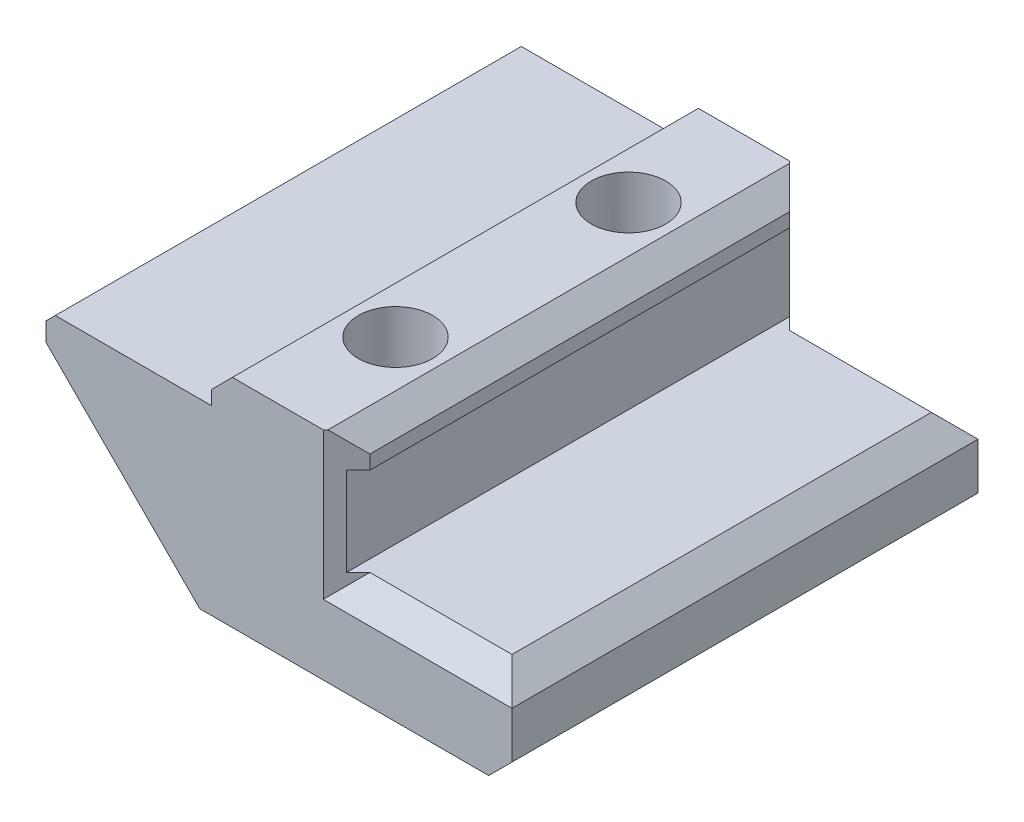
ISO-10303-21;
HEADER;
FILE_DESCRIPTION(('STEP AP214'),'2;1');
FILE_NAME('part.step','',(''),(''),'','','');
FILE_SCHEMA(('AUTOMOTIVE_DESIGN { 1 0 10303 214 1 1 1 1 }'));
ENDSEC;
DATA;
#1=APPLICATION_CONTEXT('core data for automotive mechanical design processes');
#2=APPLICATION_PROTOCOL_DEFINITION('international standard','automotive_design',2000,#1);
#3=PRODUCT_CONTEXT('',#1,'mechanical');
#4=PRODUCT('Part','Part','',(#3));
#5=PRODUCT_RELATED_PRODUCT_CATEGORY('part','',(#4));
#6=PRODUCT_DEFINITION_FORMATION('','',#4);
#7=PRODUCT_DEFINITION_CONTEXT('part definition',#1,'design');
#8=PRODUCT_DEFINITION('design','',#6,#7);
#9=PRODUCT_DEFINITION_SHAPE('','',#8);
#10=(LENGTH_UNIT() NAMED_UNIT(*) SI_UNIT(.MILLI.,.METRE.));
#11=(NAMED_UNIT(*) PLANE_ANGLE_UNIT() SI_UNIT($,.RADIAN.));
#12=(NAMED_UNIT(*) SI_UNIT($,.STERADIAN.) SOLID_ANGLE_UNIT());
#13=UNCERTAINTY_MEASURE_WITH_UNIT(LENGTH_MEASURE(1.E-05),#10,'distance_accuracy_value','');
#14=(GEOMETRIC_REPRESENTATION_CONTEXT(3) GLOBAL_UNCERTAINTY_ASSIGNED_CONTEXT((#13)) GLOBAL_UNIT_ASSIGNED_CONTEXT((#10,
#11,#12)) REPRESENTATION_CONTEXT('',''));
#15=CARTESIAN_POINT('',(0.,0.,0.));
#16=DIRECTION('',(0.,0.,1.));
#17=DIRECTION('',(1.,0.,0.));
#18=AXIS2_PLACEMENT_3D('',#15,#16,#17);
#19=CARTESIAN_POINT('',(10.,7.8,-15.));
#20=DIRECTION('',(0.,-1.,0.));
#21=DIRECTION('',(0.,0.,-1.));
#22=AXIS2_PLACEMENT_3D('',#19,#20,#21);
#23=CYLINDRICAL_SURFACE('',#22,1.6);
#24=CARTESIAN_POINT('',(10.,3.90000000000001,-15.));
#25=DIRECTION('',(0.,-1.,0.));
#26=DIRECTION('',(0.,0.,-1.));
#27=AXIS2_PLACEMENT_3D('',#24,#25,#26);
#28=CIRCLE('',#27,1.6);
#29=CARTESIAN_POINT('',(10.,3.90000000000001,-16.6));
#30=VERTEX_POINT('',#29);
#31=EDGE_CURVE('E305',#30,#30,#28,.T.);
#32=ORIENTED_EDGE('',*,*,#31,.T.);
#33=EDGE_LOOP('',(#32));
#34=FACE_BOUND('',#33,.T.);
#35=CARTESIAN_POINT('',(10.,9.3,-15.));
#36=DIRECTION('',(0.,1.,0.));
#37=DIRECTION('',(0.,0.,1.));
#38=AXIS2_PLACEMENT_3D('',#35,#36,#37);
#39=CIRCLE('',#38,1.6);
#40=CARTESIAN_POINT('',(10.,9.3,-13.4));
#41=VERTEX_POINT('',#40);
#42=EDGE_CURVE('E336',#41,#41,#39,.T.);
#43=ORIENTED_EDGE('',*,*,#42,.T.);
#44=EDGE_LOOP('',(#43));
#45=FACE_BOUND('',#44,.T.);
#46=ADVANCED_FACE('F37',(#34,#45),#23,.F.);
#47=CARTESIAN_POINT('',(10.,7.8,-5.));
#48=DIRECTION('',(0.,-1.,0.));
#49=DIRECTION('',(0.,0.,-1.));
#50=AXIS2_PLACEMENT_3D('',#47,#48,#49);
#51=CYLINDRICAL_SURFACE('',#50,1.6);
#52=CARTESIAN_POINT('',(10.,3.90000000000001,-5.));
#53=DIRECTION('',(0.,-1.,0.));
#54=DIRECTION('',(0.,0.,-1.));
#55=AXIS2_PLACEMENT_3D('',#52,#53,#54);
#56=CIRCLE('',#55,1.6);
#57=CARTESIAN_POINT('',(10.,3.90000000000001,-6.6));
#58=VERTEX_POINT('',#57);
#59=EDGE_CURVE('E302',#58,#58,#56,.T.);
#60=ORIENTED_EDGE('',*,*,#59,.T.);
#61=EDGE_LOOP('',(#60));
#62=FACE_BOUND('',#61,.T.);
#63=CARTESIAN_POINT('',(10.,9.3,-5.));
#64=DIRECTION('',(0.,1.,0.));
#65=DIRECTION('',(0.,0.,1.));
#66=AXIS2_PLACEMENT_3D('',#63,#64,#65);
#67=CIRCLE('',#66,1.6);
#68=CARTESIAN_POINT('',(10.,9.3,-3.4));
#69=VERTEX_POINT('',#68);
#70=EDGE_CURVE('E341',#69,#69,#67,.T.);
#71=ORIENTED_EDGE('',*,*,#70,.T.);
#72=EDGE_LOOP('',(#71));
#73=FACE_BOUND('',#72,.T.);
#74=ADVANCED_FACE('F422',(#62,#73),#51,.F.);
#75=CARTESIAN_POINT('',(0.,4.,0.));
#76=DIRECTION('',(0.,-1.,0.));
#77=DIRECTION('',(0.,0.,-1.));
#78=AXIS2_PLACEMENT_3D('',#75,#76,#77);
#79=PLANE('',#78);
#80=DIRECTION('',(-1.,0.,0.));
#81=VECTOR('',#80,1.);
#82=CARTESIAN_POINT('',(0.,4.,-19.));
#83=LINE('',#82,#81);
#84=CARTESIAN_POINT('',(19.,4.,-19.));
#85=VERTEX_POINT('',#84);
#86=CARTESIAN_POINT('',(12.9,4.,-19.));
#87=VERTEX_POINT('',#86);
#88=EDGE_CURVE('E210',#85,#87,#83,.T.);
#89=ORIENTED_EDGE('',*,*,#88,.T.);
#90=DIRECTION('',(0.707106781186546,0.,0.707106781186549));
#91=VECTOR('',#90,1.);
#92=CARTESIAN_POINT('',(11.9,4.,-20.));
#93=LINE('',#92,#91);
#94=CARTESIAN_POINT('',(12.4,4.,-19.5));
#95=VERTEX_POINT('',#94);
#96=EDGE_CURVE('E11',#87,#95,#93,.F.);
#97=ORIENTED_EDGE('',*,*,#96,.T.);
#98=DIRECTION('',(0.,0.,-1.));
#99=VECTOR('',#98,1.);
#100=CARTESIAN_POINT('',(12.4,4.,-20.));
#101=LINE('',#100,#99);
#102=CARTESIAN_POINT('',(12.4,4.,-0.5));
#103=VERTEX_POINT('',#102);
#104=EDGE_CURVE('E53',#103,#95,#101,.T.);
#105=ORIENTED_EDGE('',*,*,#104,.F.);
#106=DIRECTION('',(-0.707106781186549,0.,0.707106781186546));
#107=VECTOR('',#106,1.);
#108=CARTESIAN_POINT('',(12.9,4.,-1.));
#109=LINE('',#108,#107);
#110=CARTESIAN_POINT('',(12.9,4.,-1.));
#111=VERTEX_POINT('',#110);
#112=EDGE_CURVE('E226',#103,#111,#109,.F.);
#113=ORIENTED_EDGE('',*,*,#112,.T.);
#114=DIRECTION('',(1.,0.,0.));
#115=VECTOR('',#114,1.);
#116=CARTESIAN_POINT('',(0.,4.,-1.));
#117=LINE('',#116,#115);
#118=CARTESIAN_POINT('',(19.,4.,-1.));
#119=VERTEX_POINT('',#118);
#120=EDGE_CURVE('E213',#111,#119,#117,.T.);
#121=ORIENTED_EDGE('',*,*,#120,.T.);
#122=DIRECTION('',(0.,0.,-1.));
#123=VECTOR('',#122,1.);
#124=CARTESIAN_POINT('',(19.,4.,0.));
#125=LINE('',#124,#123);
#126=EDGE_CURVE('E208',#119,#85,#125,.T.);
#127=ORIENTED_EDGE('',*,*,#126,.T.);
#128=EDGE_LOOP('',(#89,#97,#105,#113,#121,#127));
#129=FACE_BOUND('',#128,.T.);
#130=ADVANCED_FACE('F267',(#129),#79,.F.);
#131=CARTESIAN_POINT('',(0.,4.,0.));
#132=DIRECTION('',(1.,0.,0.));
#133=DIRECTION('',(0.,0.,-1.));
#134=AXIS2_PLACEMENT_3D('',#131,#132,#133);
#135=PLANE('',#134);
#136=DIRECTION('',(0.,-1.,0.));
#137=VECTOR('',#136,1.);
#138=CARTESIAN_POINT('',(0.,4.,0.));
#139=LINE('',#138,#137);
#140=CARTESIAN_POINT('',(0.,7.4,0.));
#141=VERTEX_POINT('',#140);
#142=CARTESIAN_POINT('',(0.,6.6,0.));
#143=VERTEX_POINT('',#142);
#144=EDGE_CURVE('E308',#141,#143,#139,.T.);
#145=ORIENTED_EDGE('',*,*,#144,.F.);
#146=DIRECTION('',(0.,0.,-1.));
#147=VECTOR('',#146,1.);
#148=CARTESIAN_POINT('',(0.,7.4,-20.));
#149=LINE('',#148,#147);
#150=CARTESIAN_POINT('',(0.,7.4,-20.));
#151=VERTEX_POINT('',#150);
#152=EDGE_CURVE('E240',#141,#151,#149,.T.);
#153=ORIENTED_EDGE('',*,*,#152,.T.);
#154=DIRECTION('',(0.,-1.,0.));
#155=VECTOR('',#154,1.);
#156=CARTESIAN_POINT('',(0.,4.,-20.));
#157=LINE('',#156,#155);
#158=CARTESIAN_POINT('',(0.,6.6,-20.));
#159=VERTEX_POINT('',#158);
#160=EDGE_CURVE('E315',#151,#159,#157,.T.);
#161=ORIENTED_EDGE('',*,*,#160,.T.);
#162=DIRECTION('',(0.,0.,1.));
#163=VECTOR('',#162,1.);
#164=CARTESIAN_POINT('',(0.,6.6,0.));
#165=LINE('',#164,#163);
#166=EDGE_CURVE('E293',#159,#143,#165,.T.);
#167=ORIENTED_EDGE('',*,*,#166,.T.);
#168=EDGE_LOOP('',(#145,#153,#161,#167));
#169=FACE_BOUND('',#168,.T.);
#170=ADVANCED_FACE('F439',(#169),#135,.F.);
#171=CARTESIAN_POINT('',(0.,4.,0.));
#172=DIRECTION('',(0.,0.,-1.));
#173=DIRECTION('',(-1.,0.,0.));
#174=AXIS2_PLACEMENT_3D('',#171,#172,#173);
#175=PLANE('',#174);
#176=DIRECTION('',(1.,0.,0.));
#177=VECTOR('',#176,1.);
#178=CARTESIAN_POINT('',(7.1,9.3,0.));
#179=LINE('',#178,#177);
#180=CARTESIAN_POINT('',(8.,9.3,0.));
#181=VERTEX_POINT('',#180);
#182=CARTESIAN_POINT('',(11.9,9.3,0.));
#183=VERTEX_POINT('',#182);
#184=EDGE_CURVE('E335',#181,#183,#179,.T.);
#185=ORIENTED_EDGE('',*,*,#184,.F.);
#186=DIRECTION('',(-0.707106781186546,-0.707106781186549,0.));
#187=VECTOR('',#186,1.);
#188=CARTESIAN_POINT('',(8.,9.3,0.));
#189=LINE('',#188,#187);
#190=CARTESIAN_POINT('',(7.1,8.4,0.));
#191=VERTEX_POINT('',#190);
#192=EDGE_CURVE('E255',#181,#191,#189,.T.);
#193=ORIENTED_EDGE('',*,*,#192,.T.);
#194=DIRECTION('',(0.,-1.,0.));
#195=VECTOR('',#194,1.);
#196=CARTESIAN_POINT('',(7.1,9.3,0.));
#197=LINE('',#196,#195);
#198=CARTESIAN_POINT('',(7.1,7.8,0.));
#199=VERTEX_POINT('',#198);
#200=EDGE_CURVE('E328',#191,#199,#197,.T.);
#201=ORIENTED_EDGE('',*,*,#200,.T.);
#202=DIRECTION('',(1.,0.,0.));
#203=VECTOR('',#202,1.);
#204=CARTESIAN_POINT('',(0.,7.8,0.));
#205=LINE('',#204,#203);
#206=CARTESIAN_POINT('',(0.400000000000001,7.8,0.));
#207=VERTEX_POINT('',#206);
#208=EDGE_CURVE('E325',#207,#199,#205,.T.);
#209=ORIENTED_EDGE('',*,*,#208,.F.);
#210=DIRECTION('',(-0.707106781186548,-0.707106781186548,0.));
#211=VECTOR('',#210,1.);
#212=CARTESIAN_POINT('',(0.400000000000001,7.8,0.));
#213=LINE('',#212,#211);
#214=EDGE_CURVE('E238',#207,#141,#213,.T.);
#215=ORIENTED_EDGE('',*,*,#214,.T.);
#216=ORIENTED_EDGE('',*,*,#144,.T.);
#217=DIRECTION('',(0.707106781186549,-0.707106781186546,0.));
#218=VECTOR('',#217,1.);
#219=CARTESIAN_POINT('',(0.,6.6,0.));
#220=LINE('',#219,#218);
#221=CARTESIAN_POINT('',(6.60000000000002,0.,0.));
#222=VERTEX_POINT('',#221);
#223=EDGE_CURVE('E291',#143,#222,#220,.T.);
#224=ORIENTED_EDGE('',*,*,#223,.T.);
#225=DIRECTION('',(1.,0.,0.));
#226=VECTOR('',#225,1.);
#227=CARTESIAN_POINT('',(0.,0.,0.));
#228=LINE('',#227,#226);
#229=CARTESIAN_POINT('',(19.,0.,0.));
#230=VERTEX_POINT('',#229);
#231=EDGE_CURVE('E319',#222,#230,#228,.T.);
#232=ORIENTED_EDGE('',*,*,#231,.T.);
#233=DIRECTION('',(0.707106781186549,0.707106781186546,0.));
#234=VECTOR('',#233,1.);
#235=CARTESIAN_POINT('',(20.,1.,0.));
#236=LINE('',#235,#234);
#237=CARTESIAN_POINT('',(20.,1.,0.));
#238=VERTEX_POINT('',#237);
#239=EDGE_CURVE('E201',#230,#238,#236,.T.);
#240=ORIENTED_EDGE('',*,*,#239,.T.);
#241=DIRECTION('',(0.,-1.,0.));
#242=VECTOR('',#241,1.);
#243=CARTESIAN_POINT('',(20.,4.,0.));
#244=LINE('',#243,#242);
#245=CARTESIAN_POINT('',(20.,3.,0.));
#246=VERTEX_POINT('',#245);
#247=EDGE_CURVE('E310',#246,#238,#244,.T.);
#248=ORIENTED_EDGE('',*,*,#247,.F.);
#249=DIRECTION('',(-1.,0.,0.));
#250=VECTOR('',#249,1.);
#251=CARTESIAN_POINT('',(0.,3.,0.));
#252=LINE('',#251,#250);
#253=CARTESIAN_POINT('',(11.9,3.,0.));
#254=VERTEX_POINT('',#253);
#255=EDGE_CURVE('E203',#246,#254,#252,.T.);
#256=ORIENTED_EDGE('',*,*,#255,.T.);
#257=DIRECTION('',(0.,1.,0.));
#258=VECTOR('',#257,1.);
#259=CARTESIAN_POINT('',(11.9,4.,0.));
#260=LINE('',#259,#258);
#261=EDGE_CURVE('E205',#254,#183,#260,.T.);
#262=ORIENTED_EDGE('',*,*,#261,.T.);
#263=EDGE_LOOP('',(#185,#193,#201,#209,#215,#216,#224,#232,#240,#248,#256,#262));
#264=FACE_BOUND('',#263,.T.);
#265=ADVANCED_FACE('F375',(#264),#175,.F.);
#266=CARTESIAN_POINT('',(20.,4.,0.));
#267=DIRECTION('',(-1.,0.,0.));
#268=DIRECTION('',(0.,0.,1.));
#269=AXIS2_PLACEMENT_3D('',#266,#267,#268);
#270=PLANE('',#269);
#271=DIRECTION('',(0.,-1.,0.));
#272=VECTOR('',#271,1.);
#273=CARTESIAN_POINT('',(20.,4.,-20.));
#274=LINE('',#273,#272);
#275=CARTESIAN_POINT('',(20.,3.,-20.));
#276=VERTEX_POINT('',#275);
#277=CARTESIAN_POINT('',(20.,1.,-20.));
#278=VERTEX_POINT('',#277);
#279=EDGE_CURVE('E313',#276,#278,#274,.T.);
#280=ORIENTED_EDGE('',*,*,#279,.F.);
#281=DIRECTION('',(0.,0.,1.));
#282=VECTOR('',#281,1.);
#283=CARTESIAN_POINT('',(20.,3.,0.));
#284=LINE('',#283,#282);
#285=EDGE_CURVE('E218',#276,#246,#284,.T.);
#286=ORIENTED_EDGE('',*,*,#285,.T.);
#287=ORIENTED_EDGE('',*,*,#247,.T.);
#288=DIRECTION('',(0.,0.,-1.));
#289=VECTOR('',#288,1.);
#290=CARTESIAN_POINT('',(20.,1.,-20.));
#291=LINE('',#290,#289);
#292=EDGE_CURVE('E215',#238,#278,#291,.T.);
#293=ORIENTED_EDGE('',*,*,#292,.T.);
#294=EDGE_LOOP('',(#280,#286,#287,#293));
#295=FACE_BOUND('',#294,.T.);
#296=ADVANCED_FACE('F371',(#295),#270,.F.);
#297=CARTESIAN_POINT('',(0.,4.,-20.));
#298=DIRECTION('',(0.,0.,1.));
#299=DIRECTION('',(1.,0.,0.));
#300=AXIS2_PLACEMENT_3D('',#297,#298,#299);
#301=PLANE('',#300);
#302=DIRECTION('',(0.,-1.,0.));
#303=VECTOR('',#302,1.);
#304=CARTESIAN_POINT('',(7.1,9.3,-20.));
#305=LINE('',#304,#303);
#306=CARTESIAN_POINT('',(7.1,8.4,-20.));
#307=VERTEX_POINT('',#306);
#308=CARTESIAN_POINT('',(7.1,7.8,-20.));
#309=VERTEX_POINT('',#308);
#310=EDGE_CURVE('E330',#307,#309,#305,.T.);
#311=ORIENTED_EDGE('',*,*,#310,.F.);
#312=DIRECTION('',(0.707106781186546,0.707106781186549,0.));
#313=VECTOR('',#312,1.);
#314=CARTESIAN_POINT('',(8.,9.3,-20.));
#315=LINE('',#314,#313);
#316=CARTESIAN_POINT('',(8.,9.3,-20.));
#317=VERTEX_POINT('',#316);
#318=EDGE_CURVE('E258',#307,#317,#315,.T.);
#319=ORIENTED_EDGE('',*,*,#318,.T.);
#320=DIRECTION('',(-1.,0.,0.));
#321=VECTOR('',#320,1.);
#322=CARTESIAN_POINT('',(7.1,9.3,-20.));
#323=LINE('',#322,#321);
#324=CARTESIAN_POINT('',(11.9,9.3,-20.));
#325=VERTEX_POINT('',#324);
#326=EDGE_CURVE('E282',#325,#317,#323,.T.);
#327=ORIENTED_EDGE('',*,*,#326,.F.);
#328=DIRECTION('',(0.,-1.,0.));
#329=VECTOR('',#328,1.);
#330=CARTESIAN_POINT('',(11.9,4.,-20.));
#331=LINE('',#330,#329);
#332=CARTESIAN_POINT('',(11.9,3.,-20.));
#333=VERTEX_POINT('',#332);
#334=EDGE_CURVE('E196',#325,#333,#331,.T.);
#335=ORIENTED_EDGE('',*,*,#334,.T.);
#336=DIRECTION('',(1.,0.,0.));
#337=VECTOR('',#336,1.);
#338=CARTESIAN_POINT('',(0.,3.,-20.));
#339=LINE('',#338,#337);
#340=EDGE_CURVE('E272',#333,#276,#339,.T.);
#341=ORIENTED_EDGE('',*,*,#340,.T.);
#342=ORIENTED_EDGE('',*,*,#279,.T.);
#343=DIRECTION('',(-0.707106781186549,-0.707106781186546,0.));
#344=VECTOR('',#343,1.);
#345=CARTESIAN_POINT('',(20.,1.,-20.));
#346=LINE('',#345,#344);
#347=CARTESIAN_POINT('',(19.,0.,-20.));
#348=VERTEX_POINT('',#347);
#349=EDGE_CURVE('E277',#278,#348,#346,.T.);
#350=ORIENTED_EDGE('',*,*,#349,.T.);
#351=DIRECTION('',(-1.,0.,0.));
#352=VECTOR('',#351,1.);
#353=CARTESIAN_POINT('',(0.,0.,-20.));
#354=LINE('',#353,#352);
#355=CARTESIAN_POINT('',(6.60000000000002,0.,-20.));
#356=VERTEX_POINT('',#355);
#357=EDGE_CURVE('E317',#348,#356,#354,.T.);
#358=ORIENTED_EDGE('',*,*,#357,.T.);
#359=DIRECTION('',(-0.707106781186549,0.707106781186546,0.));
#360=VECTOR('',#359,1.);
#361=CARTESIAN_POINT('',(0.,6.6,-20.));
#362=LINE('',#361,#360);
#363=EDGE_CURVE('E285',#356,#159,#362,.T.);
#364=ORIENTED_EDGE('',*,*,#363,.T.);
#365=ORIENTED_EDGE('',*,*,#160,.F.);
#366=DIRECTION('',(0.707106781186548,0.707106781186548,0.));
#367=VECTOR('',#366,1.);
#368=CARTESIAN_POINT('',(0.400000000000001,7.8,-20.));
#369=LINE('',#368,#367);
#370=CARTESIAN_POINT('',(0.400000000000001,7.8,-20.));
#371=VERTEX_POINT('',#370);
#372=EDGE_CURVE('E242',#151,#371,#369,.T.);
#373=ORIENTED_EDGE('',*,*,#372,.T.);
#374=DIRECTION('',(-1.,0.,0.));
#375=VECTOR('',#374,1.);
#376=CARTESIAN_POINT('',(0.,7.8,-20.));
#377=LINE('',#376,#375);
#378=EDGE_CURVE('E322',#309,#371,#377,.T.);
#379=ORIENTED_EDGE('',*,*,#378,.F.);
#380=EDGE_LOOP('',(#311,#319,#327,#335,#341,#342,#350,#358,#364,#365,#373,#379));
#381=FACE_BOUND('',#380,.T.);
#382=ADVANCED_FACE('F280',(#381),#301,.F.);
#383=CARTESIAN_POINT('',(0.,0.,0.));
#384=DIRECTION('',(0.,-1.,0.));
#385=DIRECTION('',(0.,0.,-1.));
#386=AXIS2_PLACEMENT_3D('',#383,#384,#385);
#387=PLANE('',#386);
#388=CARTESIAN_POINT('',(10.,0.,-5.));
#389=DIRECTION('',(0.,-1.,0.));
#390=DIRECTION('',(0.,0.,-1.));
#391=AXIS2_PLACEMENT_3D('',#388,#389,#390);
#392=CIRCLE('',#391,3.);
#393=CARTESIAN_POINT('',(10.,0.,-8.));
#394=VERTEX_POINT('',#393);
#395=EDGE_CURVE('E344',#394,#394,#392,.T.);
#396=ORIENTED_EDGE('',*,*,#395,.F.);
#397=EDGE_LOOP('',(#396));
#398=FACE_BOUND('',#397,.T.);
#399=CARTESIAN_POINT('',(10.,0.,-15.));
#400=DIRECTION('',(0.,-1.,0.));
#401=DIRECTION('',(0.,0.,-1.));
#402=AXIS2_PLACEMENT_3D('',#399,#400,#401);
#403=CIRCLE('',#402,3.);
#404=CARTESIAN_POINT('',(10.,0.,-18.));
#405=VERTEX_POINT('',#404);
#406=EDGE_CURVE('E235',#405,#405,#403,.T.);
#407=ORIENTED_EDGE('',*,*,#406,.F.);
#408=EDGE_LOOP('',(#407));
#409=FACE_BOUND('',#408,.T.);
#410=ORIENTED_EDGE('',*,*,#357,.F.);
#411=DIRECTION('',(0.,0.,1.));
#412=VECTOR('',#411,1.);
#413=CARTESIAN_POINT('',(19.,0.,0.));
#414=LINE('',#413,#412);
#415=EDGE_CURVE('E220',#348,#230,#414,.T.);
#416=ORIENTED_EDGE('',*,*,#415,.T.);
#417=ORIENTED_EDGE('',*,*,#231,.F.);
#418=DIRECTION('',(0.,0.,-1.));
#419=VECTOR('',#418,1.);
#420=CARTESIAN_POINT('',(6.60000000000002,0.,-20.));
#421=LINE('',#420,#419);
#422=EDGE_CURVE('E288',#222,#356,#421,.T.);
#423=ORIENTED_EDGE('',*,*,#422,.T.);
#424=EDGE_LOOP('',(#410,#416,#417,#423));
#425=FACE_BOUND('',#424,.T.);
#426=ADVANCED_FACE('F383',(#398,#409,#425),#387,.T.);
#427=CARTESIAN_POINT('',(12.9,7.8,-20.));
#428=DIRECTION('',(-1.,0.,0.));
#429=DIRECTION('',(0.,0.,1.));
#430=AXIS2_PLACEMENT_3D('',#427,#428,#429);
#431=PLANE('',#430);
#432=DIRECTION('',(0.,-1.,0.));
#433=VECTOR('',#432,1.);
#434=CARTESIAN_POINT('',(12.9,7.8,-1.));
#435=LINE('',#434,#433);
#436=CARTESIAN_POINT('',(12.9,8.4,-1.));
#437=VERTEX_POINT('',#436);
#438=CARTESIAN_POINT('',(12.9,7.8,-1.));
#439=VERTEX_POINT('',#438);
#440=EDGE_CURVE('E185',#437,#439,#435,.T.);
#441=ORIENTED_EDGE('',*,*,#440,.T.);
#442=DIRECTION('',(0.,0.,1.));
#443=VECTOR('',#442,1.);
#444=CARTESIAN_POINT('',(12.9,7.8,-20.));
#445=LINE('',#444,#443);
#446=CARTESIAN_POINT('',(12.9,7.8,-19.));
#447=VERTEX_POINT('',#446);
#448=EDGE_CURVE('E171',#447,#439,#445,.T.);
#449=ORIENTED_EDGE('',*,*,#448,.F.);
#450=DIRECTION('',(0.,1.,0.));
#451=VECTOR('',#450,1.);
#452=CARTESIAN_POINT('',(12.9,7.8,-19.));
#453=LINE('',#452,#451);
#454=CARTESIAN_POINT('',(12.9,8.4,-19.));
#455=VERTEX_POINT('',#454);
#456=EDGE_CURVE('E182',#447,#455,#453,.T.);
#457=ORIENTED_EDGE('',*,*,#456,.T.);
#458=DIRECTION('',(0.,0.,1.));
#459=VECTOR('',#458,1.);
#460=CARTESIAN_POINT('',(12.9,8.4,-1.));
#461=LINE('',#460,#459);
#462=EDGE_CURVE('E251',#455,#437,#461,.T.);
#463=ORIENTED_EDGE('',*,*,#462,.T.);
#464=EDGE_LOOP('',(#441,#449,#457,#463));
#465=FACE_BOUND('',#464,.T.);
#466=ADVANCED_FACE('F181',(#465),#431,.F.);
#467=CARTESIAN_POINT('',(0.,7.8,0.));
#468=DIRECTION('',(0.,1.,0.));
#469=DIRECTION('',(0.,0.,1.));
#470=AXIS2_PLACEMENT_3D('',#467,#468,#469);
#471=PLANE('',#470);
#472=ORIENTED_EDGE('',*,*,#378,.T.);
#473=DIRECTION('',(0.,0.,1.));
#474=VECTOR('',#473,1.);
#475=CARTESIAN_POINT('',(0.400000000000001,7.8,0.));
#476=LINE('',#475,#474);
#477=EDGE_CURVE('E222',#371,#207,#476,.T.);
#478=ORIENTED_EDGE('',*,*,#477,.T.);
#479=ORIENTED_EDGE('',*,*,#208,.T.);
#480=DIRECTION('',(0.,0.,1.));
#481=VECTOR('',#480,1.);
#482=CARTESIAN_POINT('',(7.1,7.8,-20.));
#483=LINE('',#482,#481);
#484=EDGE_CURVE('E332',#309,#199,#483,.T.);
#485=ORIENTED_EDGE('',*,*,#484,.F.);
#486=EDGE_LOOP('',(#472,#478,#479,#485));
#487=FACE_BOUND('',#486,.T.);
#488=ADVANCED_FACE('F400',(#487),#471,.T.);
#489=CARTESIAN_POINT('',(0.,9.3,0.));
#490=DIRECTION('',(0.,1.,0.));
#491=DIRECTION('',(0.,0.,1.));
#492=AXIS2_PLACEMENT_3D('',#489,#490,#491);
#493=PLANE('',#492);
#494=ORIENTED_EDGE('',*,*,#42,.F.);
#495=EDGE_LOOP('',(#494));
#496=FACE_BOUND('',#495,.T.);
#497=DIRECTION('',(-0.707106781186549,0.,0.707106781186546));
#498=VECTOR('',#497,1.);
#499=CARTESIAN_POINT('',(5.94999999999998,9.3,5.95));
#500=LINE('',#499,#498);
#501=CARTESIAN_POINT('',(12.,9.3,-0.100000000000006));
#502=VERTEX_POINT('',#501);
#503=EDGE_CURVE('E191',#183,#502,#500,.F.);
#504=ORIENTED_EDGE('',*,*,#503,.T.);
#505=DIRECTION('',(0.,0.,-1.));
#506=VECTOR('',#505,1.);
#507=CARTESIAN_POINT('',(12.,9.3,-19.));
#508=LINE('',#507,#506);
#509=CARTESIAN_POINT('',(12.,9.3,-19.9));
#510=VERTEX_POINT('',#509);
#511=EDGE_CURVE('E247',#502,#510,#508,.T.);
#512=ORIENTED_EDGE('',*,*,#511,.T.);
#513=DIRECTION('',(0.707106781186546,0.,0.707106781186549));
#514=VECTOR('',#513,1.);
#515=CARTESIAN_POINT('',(15.95,9.3,-15.95));
#516=LINE('',#515,#514);
#517=EDGE_CURVE('E194',#510,#325,#516,.F.);
#518=ORIENTED_EDGE('',*,*,#517,.T.);
#519=ORIENTED_EDGE('',*,*,#326,.T.);
#520=DIRECTION('',(0.,0.,1.));
#521=VECTOR('',#520,1.);
#522=CARTESIAN_POINT('',(8.,9.3,0.));
#523=LINE('',#522,#521);
#524=EDGE_CURVE('E244',#317,#181,#523,.T.);
#525=ORIENTED_EDGE('',*,*,#524,.T.);
#526=ORIENTED_EDGE('',*,*,#184,.T.);
#527=EDGE_LOOP('',(#504,#512,#518,#519,#525,#526));
#528=FACE_BOUND('',#527,.T.);
#529=ORIENTED_EDGE('',*,*,#70,.F.);
#530=EDGE_LOOP('',(#529));
#531=FACE_BOUND('',#530,.T.);
#532=ADVANCED_FACE('F408',(#496,#528,#531),#493,.T.);
#533=CARTESIAN_POINT('',(7.1,9.3,-20.));
#534=DIRECTION('',(1.,0.,0.));
#535=DIRECTION('',(0.,0.,-1.));
#536=AXIS2_PLACEMENT_3D('',#533,#534,#535);
#537=PLANE('',#536);
#538=ORIENTED_EDGE('',*,*,#200,.F.);
#539=DIRECTION('',(0.,0.,-1.));
#540=VECTOR('',#539,1.);
#541=CARTESIAN_POINT('',(7.1,8.4,-20.));
#542=LINE('',#541,#540);
#543=EDGE_CURVE('E60',#191,#307,#542,.T.);
#544=ORIENTED_EDGE('',*,*,#543,.T.);
#545=ORIENTED_EDGE('',*,*,#310,.T.);
#546=ORIENTED_EDGE('',*,*,#484,.T.);
#547=EDGE_LOOP('',(#538,#544,#545,#546));
#548=FACE_BOUND('',#547,.T.);
#549=ADVANCED_FACE('F403',(#548),#537,.F.);
#550=CARTESIAN_POINT('',(10.,2.4,-5.));
#551=DIRECTION('',(0.,-1.,0.));
#552=DIRECTION('',(0.,0.,-1.));
#553=AXIS2_PLACEMENT_3D('',#550,#551,#552);
#554=CYLINDRICAL_SURFACE('',#553,3.);
#555=CARTESIAN_POINT('',(10.,2.50000000000002,-5.));
#556=DIRECTION('',(0.,-1.,0.));
#557=DIRECTION('',(0.,0.,-1.));
#558=AXIS2_PLACEMENT_3D('',#555,#556,#557);
#559=CIRCLE('',#558,3.);
#560=CARTESIAN_POINT('',(10.,2.50000000000002,-8.));
#561=VERTEX_POINT('',#560);
#562=EDGE_CURVE('E296',#561,#561,#559,.F.);
#563=ORIENTED_EDGE('',*,*,#562,.T.);
#564=EDGE_LOOP('',(#563));
#565=FACE_BOUND('',#564,.T.);
#566=ORIENTED_EDGE('',*,*,#395,.T.);
#567=EDGE_LOOP('',(#566));
#568=FACE_BOUND('',#567,.T.);
#569=ADVANCED_FACE('F553',(#565,#568),#554,.F.);
#570=CARTESIAN_POINT('',(10.,2.4,-15.));
#571=DIRECTION('',(0.,-1.,0.));
#572=DIRECTION('',(0.,0.,-1.));
#573=AXIS2_PLACEMENT_3D('',#570,#571,#572);
#574=CYLINDRICAL_SURFACE('',#573,3.);
#575=CARTESIAN_POINT('',(10.,2.50000000000002,-15.));
#576=DIRECTION('',(0.,-1.,0.));
#577=DIRECTION('',(0.,0.,-1.));
#578=AXIS2_PLACEMENT_3D('',#575,#576,#577);
#579=CIRCLE('',#578,3.);
#580=CARTESIAN_POINT('',(10.,2.50000000000002,-18.));
#581=VERTEX_POINT('',#580);
#582=EDGE_CURVE('E299',#581,#581,#579,.F.);
#583=ORIENTED_EDGE('',*,*,#582,.T.);
#584=EDGE_LOOP('',(#583));
#585=FACE_BOUND('',#584,.T.);
#586=ORIENTED_EDGE('',*,*,#406,.T.);
#587=EDGE_LOOP('',(#586));
#588=FACE_BOUND('',#587,.T.);
#589=ADVANCED_FACE('F459',(#585,#588),#574,.F.);
#590=CARTESIAN_POINT('',(10.,2.4,-15.));
#591=DIRECTION('',(0.,-1.,0.));
#592=DIRECTION('',(0.,0.,-1.));
#593=AXIS2_PLACEMENT_3D('',#590,#591,#592);
#594=CONICAL_SURFACE('',#593,3.10000000000003,0.785398163397453);
#595=ORIENTED_EDGE('',*,*,#31,.F.);
#596=EDGE_LOOP('',(#595));
#597=FACE_BOUND('',#596,.T.);
#598=ORIENTED_EDGE('',*,*,#582,.F.);
#599=EDGE_LOOP('',(#598));
#600=FACE_BOUND('',#599,.T.);
#601=ADVANCED_FACE('F452',(#597,#600),#594,.F.);
#602=CARTESIAN_POINT('',(10.,2.4,-5.));
#603=DIRECTION('',(0.,-1.,0.));
#604=DIRECTION('',(0.,0.,-1.));
#605=AXIS2_PLACEMENT_3D('',#602,#603,#604);
#606=CONICAL_SURFACE('',#605,3.10000000000003,0.785398163397453);
#607=ORIENTED_EDGE('',*,*,#59,.F.);
#608=EDGE_LOOP('',(#607));
#609=FACE_BOUND('',#608,.T.);
#610=ORIENTED_EDGE('',*,*,#562,.F.);
#611=EDGE_LOOP('',(#610));
#612=FACE_BOUND('',#611,.T.);
#613=ADVANCED_FACE('F458',(#609,#612),#606,.F.);
#614=CARTESIAN_POINT('',(0.,6.6,0.));
#615=DIRECTION('',(-0.707106781186546,-0.707106781186549,0.));
#616=DIRECTION('',(0.,0.,-1.));
#617=AXIS2_PLACEMENT_3D('',#614,#615,#616);
#618=PLANE('',#617);
#619=ORIENTED_EDGE('',*,*,#363,.F.);
#620=ORIENTED_EDGE('',*,*,#422,.F.);
#621=ORIENTED_EDGE('',*,*,#223,.F.);
#622=ORIENTED_EDGE('',*,*,#166,.F.);
#623=EDGE_LOOP('',(#619,#620,#621,#622));
#624=FACE_BOUND('',#623,.T.);
#625=ADVANCED_FACE('F389',(#624),#618,.T.);
#626=CARTESIAN_POINT('',(12.9,7.8,-1.));
#627=DIRECTION('',(-0.707106781186546,0.,-0.707106781186549));
#628=DIRECTION('',(0.,-1.,0.));
#629=AXIS2_PLACEMENT_3D('',#626,#627,#628);
#630=PLANE('',#629);
#631=ORIENTED_EDGE('',*,*,#112,.F.);
#632=DIRECTION('',(0.,1.,0.));
#633=VECTOR('',#632,1.);
#634=CARTESIAN_POINT('',(12.4,7.8,-0.500000000000002));
#635=LINE('',#634,#633);
#636=CARTESIAN_POINT('',(12.4,7.8,-0.5));
#637=VERTEX_POINT('',#636);
#638=EDGE_CURVE('E352',#637,#103,#635,.F.);
#639=ORIENTED_EDGE('',*,*,#638,.F.);
#640=DIRECTION('',(0.707106781186549,0.,-0.707106781186546));
#641=VECTOR('',#640,1.);
#642=CARTESIAN_POINT('',(12.9,7.8,-1.));
#643=LINE('',#642,#641);
#644=EDGE_CURVE('E350',#439,#637,#643,.F.);
#645=ORIENTED_EDGE('',*,*,#644,.F.);
#646=ORIENTED_EDGE('',*,*,#440,.F.);
#647=DIRECTION('',(0.577350269189625,-0.577350269189629,-0.577350269189623));
#648=VECTOR('',#647,1.);
#649=CARTESIAN_POINT('',(13.1,8.2,-1.2));
#650=LINE('',#649,#648);
#651=EDGE_CURVE('E253',#437,#502,#650,.F.);
#652=ORIENTED_EDGE('',*,*,#651,.T.);
#653=ORIENTED_EDGE('',*,*,#503,.F.);
#654=ORIENTED_EDGE('',*,*,#261,.F.);
#655=DIRECTION('',(-0.577350269189626,-0.577350269189626,0.577350269189624));
#656=VECTOR('',#655,1.);
#657=CARTESIAN_POINT('',(14.1666666666667,5.26666666666667,-2.26666666666667));
#658=LINE('',#657,#656);
#659=EDGE_CURVE('E232',#111,#254,#658,.T.);
#660=ORIENTED_EDGE('',*,*,#659,.F.);
#661=EDGE_LOOP('',(#631,#639,#645,#646,#652,#653,#654,#660));
#662=FACE_BOUND('',#661,.T.);
#663=ADVANCED_FACE('F358',(#662),#630,.F.);
#664=CARTESIAN_POINT('',(0.,4.,-1.));
#665=DIRECTION('',(0.,-0.707106781186546,-0.707106781186549));
#666=DIRECTION('',(1.,0.,0.));
#667=AXIS2_PLACEMENT_3D('',#664,#665,#666);
#668=PLANE('',#667);
#669=ORIENTED_EDGE('',*,*,#659,.T.);
#670=ORIENTED_EDGE('',*,*,#255,.F.);
#671=DIRECTION('',(0.577350269189625,-0.577350269189627,0.577350269189625));
#672=VECTOR('',#671,1.);
#673=CARTESIAN_POINT('',(19.3333333333333,3.66666666666667,-0.666666666666668));
#674=LINE('',#673,#672);
#675=EDGE_CURVE('E229',#119,#246,#674,.T.);
#676=ORIENTED_EDGE('',*,*,#675,.F.);
#677=ORIENTED_EDGE('',*,*,#120,.F.);
#678=EDGE_LOOP('',(#669,#670,#676,#677));
#679=FACE_BOUND('',#678,.T.);
#680=ADVANCED_FACE('F365',(#679),#668,.F.);
#681=CARTESIAN_POINT('',(19.,4.,0.));
#682=DIRECTION('',(-0.707106781186549,-0.707106781186546,0.));
#683=DIRECTION('',(0.,0.,-1.));
#684=AXIS2_PLACEMENT_3D('',#681,#682,#683);
#685=PLANE('',#684);
#686=ORIENTED_EDGE('',*,*,#675,.T.);
#687=ORIENTED_EDGE('',*,*,#285,.F.);
#688=DIRECTION('',(-0.577350269189625,0.577350269189627,0.577350269189625));
#689=VECTOR('',#688,1.);
#690=CARTESIAN_POINT('',(12.6666666666667,10.3333333333333,-12.6666666666667));
#691=LINE('',#690,#689);
#692=EDGE_CURVE('E225',#85,#276,#691,.F.);
#693=ORIENTED_EDGE('',*,*,#692,.F.);
#694=ORIENTED_EDGE('',*,*,#126,.F.);
#695=EDGE_LOOP('',(#686,#687,#693,#694));
#696=FACE_BOUND('',#695,.T.);
#697=ADVANCED_FACE('F368',(#696),#685,.F.);
#698=CARTESIAN_POINT('',(0.,4.,-19.));
#699=DIRECTION('',(0.,-0.707106781186546,0.707106781186549));
#700=DIRECTION('',(-1.,0.,0.));
#701=AXIS2_PLACEMENT_3D('',#698,#699,#700);
#702=PLANE('',#701);
#703=ORIENTED_EDGE('',*,*,#692,.T.);
#704=ORIENTED_EDGE('',*,*,#340,.F.);
#705=DIRECTION('',(0.577350269189624,0.577350269189628,0.577350269189626));
#706=VECTOR('',#705,1.);
#707=CARTESIAN_POINT('',(12.2333333333333,3.33333333333333,-19.6666666666667));
#708=LINE('',#707,#706);
#709=EDGE_CURVE('E223',#87,#333,#708,.F.);
#710=ORIENTED_EDGE('',*,*,#709,.F.);
#711=ORIENTED_EDGE('',*,*,#88,.F.);
#712=EDGE_LOOP('',(#703,#704,#710,#711));
#713=FACE_BOUND('',#712,.T.);
#714=ADVANCED_FACE('F271',(#713),#702,.F.);
#715=CARTESIAN_POINT('',(11.9,4.,-20.));
#716=DIRECTION('',(-0.707106781186549,0.,0.707106781186546));
#717=DIRECTION('',(0.,-1.,0.));
#718=AXIS2_PLACEMENT_3D('',#715,#716,#717);
#719=PLANE('',#718);
#720=ORIENTED_EDGE('',*,*,#96,.F.);
#721=ORIENTED_EDGE('',*,*,#709,.T.);
#722=ORIENTED_EDGE('',*,*,#334,.F.);
#723=ORIENTED_EDGE('',*,*,#517,.F.);
#724=DIRECTION('',(-0.577350269189624,0.577350269189627,-0.577350269189626));
#725=VECTOR('',#724,1.);
#726=CARTESIAN_POINT('',(13.7,7.59999999999999,-18.2));
#727=LINE('',#726,#725);
#728=EDGE_CURVE('E189',#510,#455,#727,.F.);
#729=ORIENTED_EDGE('',*,*,#728,.T.);
#730=ORIENTED_EDGE('',*,*,#456,.F.);
#731=DIRECTION('',(-0.707106781186546,0.,-0.707106781186549));
#732=VECTOR('',#731,1.);
#733=CARTESIAN_POINT('',(11.9,7.8,-20.));
#734=LINE('',#733,#732);
#735=CARTESIAN_POINT('',(12.4,7.8,-19.5));
#736=VERTEX_POINT('',#735);
#737=EDGE_CURVE('E46',#736,#447,#734,.F.);
#738=ORIENTED_EDGE('',*,*,#737,.F.);
#739=DIRECTION('',(0.,-1.,0.));
#740=VECTOR('',#739,1.);
#741=CARTESIAN_POINT('',(12.4,4.,-19.5));
#742=LINE('',#741,#740);
#743=EDGE_CURVE('E178',#95,#736,#742,.F.);
#744=ORIENTED_EDGE('',*,*,#743,.F.);
#745=EDGE_LOOP('',(#720,#721,#722,#723,#729,#730,#738,#744));
#746=FACE_BOUND('',#745,.T.);
#747=ADVANCED_FACE('F187',(#746),#719,.F.);
#748=CARTESIAN_POINT('',(20.,1.,0.));
#749=DIRECTION('',(0.707106781186546,-0.707106781186549,0.));
#750=DIRECTION('',(0.,0.,1.));
#751=AXIS2_PLACEMENT_3D('',#748,#749,#750);
#752=PLANE('',#751);
#753=ORIENTED_EDGE('',*,*,#239,.F.);
#754=ORIENTED_EDGE('',*,*,#415,.F.);
#755=ORIENTED_EDGE('',*,*,#349,.F.);
#756=ORIENTED_EDGE('',*,*,#292,.F.);
#757=EDGE_LOOP('',(#753,#754,#755,#756));
#758=FACE_BOUND('',#757,.T.);
#759=ADVANCED_FACE('F380',(#758),#752,.T.);
#760=CARTESIAN_POINT('',(0.400000000000001,7.8,0.));
#761=DIRECTION('',(-0.707106781186547,0.707106781186547,0.));
#762=DIRECTION('',(0.,0.,-1.));
#763=AXIS2_PLACEMENT_3D('',#760,#761,#762);
#764=PLANE('',#763);
#765=ORIENTED_EDGE('',*,*,#372,.F.);
#766=ORIENTED_EDGE('',*,*,#152,.F.);
#767=ORIENTED_EDGE('',*,*,#214,.F.);
#768=ORIENTED_EDGE('',*,*,#477,.F.);
#769=EDGE_LOOP('',(#765,#766,#767,#768));
#770=FACE_BOUND('',#769,.T.);
#771=ADVANCED_FACE('F397',(#770),#764,.T.);
#772=CARTESIAN_POINT('',(12.,9.3,0.));
#773=DIRECTION('',(0.70710678118655,0.707106781186545,0.));
#774=DIRECTION('',(0.,0.,1.));
#775=AXIS2_PLACEMENT_3D('',#772,#773,#774);
#776=PLANE('',#775);
#777=ORIENTED_EDGE('',*,*,#651,.F.);
#778=ORIENTED_EDGE('',*,*,#462,.F.);
#779=ORIENTED_EDGE('',*,*,#728,.F.);
#780=ORIENTED_EDGE('',*,*,#511,.F.);
#781=EDGE_LOOP('',(#777,#778,#779,#780));
#782=FACE_BOUND('',#781,.T.);
#783=ADVANCED_FACE('F413',(#782),#776,.T.);
#784=CARTESIAN_POINT('',(8.,9.3,0.));
#785=DIRECTION('',(-0.707106781186549,0.707106781186546,0.));
#786=DIRECTION('',(0.,0.,-1.));
#787=AXIS2_PLACEMENT_3D('',#784,#785,#786);
#788=PLANE('',#787);
#789=ORIENTED_EDGE('',*,*,#318,.F.);
#790=ORIENTED_EDGE('',*,*,#543,.F.);
#791=ORIENTED_EDGE('',*,*,#192,.F.);
#792=ORIENTED_EDGE('',*,*,#524,.F.);
#793=EDGE_LOOP('',(#789,#790,#791,#792));
#794=FACE_BOUND('',#793,.T.);
#795=ADVANCED_FACE('F40',(#794),#788,.T.);
#796=CARTESIAN_POINT('',(12.4,7.8,-20.));
#797=DIRECTION('',(0.,1.,0.));
#798=DIRECTION('',(0.,0.,1.));
#799=AXIS2_PLACEMENT_3D('',#796,#797,#798);
#800=PLANE('',#799);
#801=ORIENTED_EDGE('',*,*,#644,.T.);
#802=DIRECTION('',(0.,0.,1.));
#803=VECTOR('',#802,1.);
#804=CARTESIAN_POINT('',(12.4,7.8,-20.));
#805=LINE('',#804,#803);
#806=EDGE_CURVE('E174',#736,#637,#805,.T.);
#807=ORIENTED_EDGE('',*,*,#806,.F.);
#808=ORIENTED_EDGE('',*,*,#737,.T.);
#809=ORIENTED_EDGE('',*,*,#448,.T.);
#810=EDGE_LOOP('',(#801,#807,#808,#809));
#811=FACE_BOUND('',#810,.T.);
#812=ADVANCED_FACE('F170',(#811),#800,.F.);
#813=CARTESIAN_POINT('',(12.4,0.,0.));
#814=DIRECTION('',(-1.,0.,0.));
#815=DIRECTION('',(0.,0.,1.));
#816=AXIS2_PLACEMENT_3D('',#813,#814,#815);
#817=PLANE('',#816);
#818=ORIENTED_EDGE('',*,*,#638,.T.);
#819=ORIENTED_EDGE('',*,*,#104,.T.);
#820=ORIENTED_EDGE('',*,*,#743,.T.);
#821=ORIENTED_EDGE('',*,*,#806,.T.);
#822=EDGE_LOOP('',(#818,#819,#820,#821));
#823=FACE_BOUND('',#822,.T.);
#824=ADVANCED_FACE('F260',(#823),#817,.F.);
#825=CLOSED_SHELL('',(#46,#74,#130,#170,#265,#296,#382,#426,#466,#488,#532,#549,#569,#589,#601,
#613,#625,#663,#680,#697,#714,#747,#759,#771,#783,#795,#812,#824));
#826=MANIFOLD_SOLID_BREP('B2',#825);
#827=ADVANCED_BREP_SHAPE_REPRESENTATION('',(#18,#826),#14);
#828=SHAPE_DEFINITION_REPRESENTATION(#9,#827);
ENDSEC;
END-ISO-10303-21;
